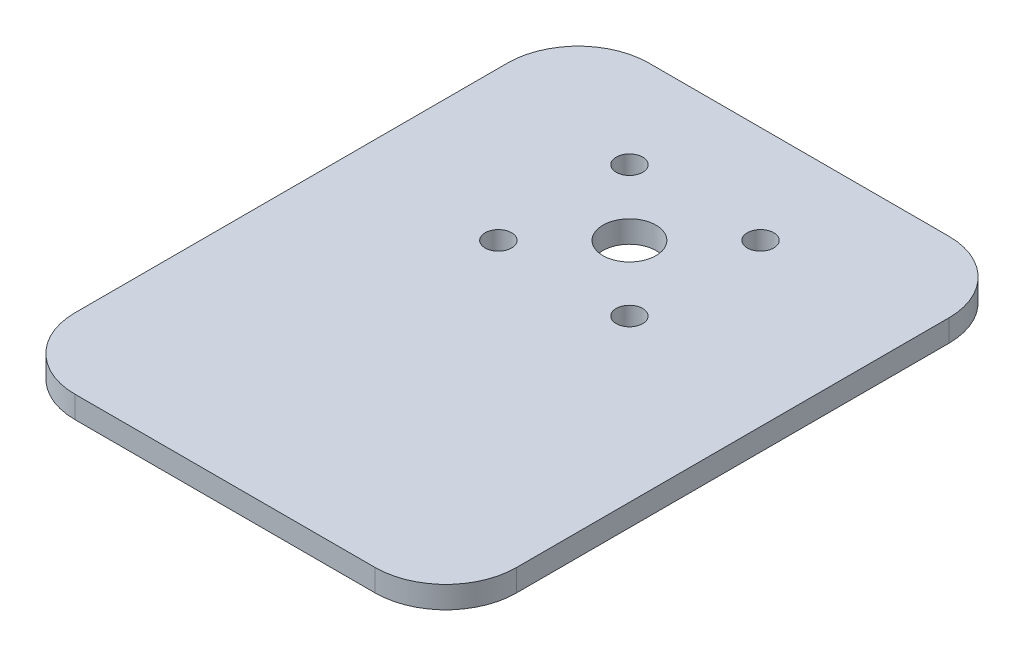
ISO-10303-21;
HEADER;
FILE_DESCRIPTION(('STEP AP214'),'2;1');
FILE_NAME('part.step','',(''),(''),'','','');
FILE_SCHEMA(('AUTOMOTIVE_DESIGN { 1 0 10303 214 1 1 1 1 }'));
ENDSEC;
DATA;
#1=APPLICATION_CONTEXT('core data for automotive mechanical design processes');
#2=APPLICATION_PROTOCOL_DEFINITION('international standard','automotive_design',2000,#1);
#3=PRODUCT_CONTEXT('',#1,'mechanical');
#4=PRODUCT('Part','Part','',(#3));
#5=PRODUCT_RELATED_PRODUCT_CATEGORY('part','',(#4));
#6=PRODUCT_DEFINITION_FORMATION('','',#4);
#7=PRODUCT_DEFINITION_CONTEXT('part definition',#1,'design');
#8=PRODUCT_DEFINITION('design','',#6,#7);
#9=PRODUCT_DEFINITION_SHAPE('','',#8);
#10=(LENGTH_UNIT() NAMED_UNIT(*) SI_UNIT(.MILLI.,.METRE.));
#11=(NAMED_UNIT(*) PLANE_ANGLE_UNIT() SI_UNIT($,.RADIAN.));
#12=(NAMED_UNIT(*) SI_UNIT($,.STERADIAN.) SOLID_ANGLE_UNIT());
#13=UNCERTAINTY_MEASURE_WITH_UNIT(LENGTH_MEASURE(1.E-05),#10,'distance_accuracy_value','');
#14=(GEOMETRIC_REPRESENTATION_CONTEXT(3) GLOBAL_UNCERTAINTY_ASSIGNED_CONTEXT((#13)) GLOBAL_UNIT_ASSIGNED_CONTEXT((#10,
#11,#12)) REPRESENTATION_CONTEXT('',''));
#15=CARTESIAN_POINT('',(0.,0.,0.));
#16=DIRECTION('',(0.,0.,1.));
#17=DIRECTION('',(1.,0.,0.));
#18=AXIS2_PLACEMENT_3D('',#15,#16,#17);
#19=CARTESIAN_POINT('',(17.,2.5,24.5));
#20=DIRECTION('',(0.,1.,0.));
#21=DIRECTION('',(0.,0.,1.));
#22=AXIS2_PLACEMENT_3D('',#19,#20,#21);
#23=PLANE('',#22);
#24=CARTESIAN_POINT('',(6.73017256995211,2.5,-6.57537879754129));
#25=DIRECTION('',(0.,1.,0.));
#26=DIRECTION('',(0.,0.,1.));
#27=AXIS2_PLACEMENT_3D('',#24,#25,#26);
#28=CIRCLE('',#27,1.5);
#29=CARTESIAN_POINT('',(6.73017256995211,2.5,-5.07537879754129));
#30=VERTEX_POINT('',#29);
#31=EDGE_CURVE('E206',#30,#30,#28,.T.);
#32=ORIENTED_EDGE('',*,*,#31,.F.);
#33=EDGE_LOOP('',(#32));
#34=FACE_BOUND('',#33,.T.);
#35=CARTESIAN_POINT('',(-8.11906983496547,2.5,-21.4246212024587));
#36=DIRECTION('',(0.,1.,0.));
#37=DIRECTION('',(0.,0.,1.));
#38=AXIS2_PLACEMENT_3D('',#35,#36,#37);
#39=CIRCLE('',#38,1.5);
#40=CARTESIAN_POINT('',(-8.11906983496547,2.5,-19.9246212024587));
#41=VERTEX_POINT('',#40);
#42=EDGE_CURVE('E194',#41,#41,#39,.T.);
#43=ORIENTED_EDGE('',*,*,#42,.F.);
#44=EDGE_LOOP('',(#43));
#45=FACE_BOUND('',#44,.T.);
#46=CARTESIAN_POINT('',(17.,2.5,24.5));
#47=DIRECTION('',(0.,1.,0.));
#48=DIRECTION('',(0.,0.,1.));
#49=AXIS2_PLACEMENT_3D('',#46,#47,#48);
#50=CIRCLE('',#49,8.);
#51=CARTESIAN_POINT('',(17.,2.5,32.5));
#52=VERTEX_POINT('',#51);
#53=CARTESIAN_POINT('',(25.,2.5,24.5));
#54=VERTEX_POINT('',#53);
#55=EDGE_CURVE('E157',#52,#54,#50,.T.);
#56=ORIENTED_EDGE('',*,*,#55,.T.);
#57=DIRECTION('',(0.,0.,-1.));
#58=VECTOR('',#57,1.);
#59=CARTESIAN_POINT('',(25.,2.5,24.5));
#60=LINE('',#59,#58);
#61=CARTESIAN_POINT('',(25.,2.5,-24.5));
#62=VERTEX_POINT('',#61);
#63=EDGE_CURVE('E105',#54,#62,#60,.T.);
#64=ORIENTED_EDGE('',*,*,#63,.T.);
#65=CARTESIAN_POINT('',(17.,2.5,-24.5));
#66=DIRECTION('',(0.,1.,0.));
#67=DIRECTION('',(0.,0.,1.));
#68=AXIS2_PLACEMENT_3D('',#65,#66,#67);
#69=CIRCLE('',#68,8.);
#70=CARTESIAN_POINT('',(17.,2.5,-32.5));
#71=VERTEX_POINT('',#70);
#72=EDGE_CURVE('E172',#62,#71,#69,.T.);
#73=ORIENTED_EDGE('',*,*,#72,.T.);
#74=DIRECTION('',(-1.,0.,0.));
#75=VECTOR('',#74,1.);
#76=CARTESIAN_POINT('',(-17.,2.5,-32.5));
#77=LINE('',#76,#75);
#78=CARTESIAN_POINT('',(-17.,2.5,-32.5));
#79=VERTEX_POINT('',#78);
#80=EDGE_CURVE('E185',#71,#79,#77,.T.);
#81=ORIENTED_EDGE('',*,*,#80,.T.);
#82=CARTESIAN_POINT('',(-17.,2.5,-24.5));
#83=DIRECTION('',(0.,1.,0.));
#84=DIRECTION('',(0.,0.,-1.));
#85=AXIS2_PLACEMENT_3D('',#82,#83,#84);
#86=CIRCLE('',#85,8.);
#87=CARTESIAN_POINT('',(-25.,2.5,-24.5));
#88=VERTEX_POINT('',#87);
#89=EDGE_CURVE('E124',#79,#88,#86,.T.);
#90=ORIENTED_EDGE('',*,*,#89,.T.);
#91=DIRECTION('',(0.,0.,1.));
#92=VECTOR('',#91,1.);
#93=CARTESIAN_POINT('',(-25.,2.5,24.5));
#94=LINE('',#93,#92);
#95=CARTESIAN_POINT('',(-25.,2.5,24.5));
#96=VERTEX_POINT('',#95);
#97=EDGE_CURVE('E118',#88,#96,#94,.T.);
#98=ORIENTED_EDGE('',*,*,#97,.T.);
#99=CARTESIAN_POINT('',(-17.,2.5,24.5));
#100=DIRECTION('',(0.,1.,0.));
#101=DIRECTION('',(0.,0.,-1.));
#102=AXIS2_PLACEMENT_3D('',#99,#100,#101);
#103=CIRCLE('',#102,8.);
#104=CARTESIAN_POINT('',(-17.,2.5,32.5));
#105=VERTEX_POINT('',#104);
#106=EDGE_CURVE('E122',#96,#105,#103,.T.);
#107=ORIENTED_EDGE('',*,*,#106,.T.);
#108=DIRECTION('',(1.,0.,0.));
#109=VECTOR('',#108,1.);
#110=CARTESIAN_POINT('',(-17.,2.5,32.5));
#111=LINE('',#110,#109);
#112=EDGE_CURVE('E62',#105,#52,#111,.T.);
#113=ORIENTED_EDGE('',*,*,#112,.T.);
#114=EDGE_LOOP('',(#56,#64,#73,#81,#90,#98,#107,#113));
#115=FACE_BOUND('',#114,.T.);
#116=CARTESIAN_POINT('',(6.73017256995211,2.5,-21.4246212024587));
#117=DIRECTION('',(0.,1.,0.));
#118=DIRECTION('',(0.,0.,1.));
#119=AXIS2_PLACEMENT_3D('',#116,#117,#118);
#120=CIRCLE('',#119,1.5);
#121=CARTESIAN_POINT('',(6.73017256995211,2.5,-19.9246212024587));
#122=VERTEX_POINT('',#121);
#123=EDGE_CURVE('E146',#122,#122,#120,.T.);
#124=ORIENTED_EDGE('',*,*,#123,.F.);
#125=EDGE_LOOP('',(#124));
#126=FACE_BOUND('',#125,.T.);
#127=CARTESIAN_POINT('',(-8.11906983496547,2.5,-6.57537879754129));
#128=DIRECTION('',(0.,1.,0.));
#129=DIRECTION('',(0.,0.,1.));
#130=AXIS2_PLACEMENT_3D('',#127,#128,#129);
#131=CIRCLE('',#130,1.5);
#132=CARTESIAN_POINT('',(-8.11906983496547,2.5,-5.07537879754129));
#133=VERTEX_POINT('',#132);
#134=EDGE_CURVE('E200',#133,#133,#131,.T.);
#135=ORIENTED_EDGE('',*,*,#134,.F.);
#136=EDGE_LOOP('',(#135));
#137=FACE_BOUND('',#136,.T.);
#138=CARTESIAN_POINT('',(-0.694448632506681,2.5,-14.));
#139=DIRECTION('',(0.,1.,0.));
#140=DIRECTION('',(0.,0.,1.));
#141=AXIS2_PLACEMENT_3D('',#138,#139,#140);
#142=CIRCLE('',#141,3.);
#143=CARTESIAN_POINT('',(-0.694448632506681,2.5,-11.));
#144=VERTEX_POINT('',#143);
#145=EDGE_CURVE('E212',#144,#144,#142,.T.);
#146=ORIENTED_EDGE('',*,*,#145,.F.);
#147=EDGE_LOOP('',(#146));
#148=FACE_BOUND('',#147,.T.);
#149=ADVANCED_FACE('F45',(#34,#45,#115,#126,#137,#148),#23,.T.);
#150=CARTESIAN_POINT('',(17.,0.,24.5));
#151=DIRECTION('',(0.,1.,0.));
#152=DIRECTION('',(0.,0.,1.));
#153=AXIS2_PLACEMENT_3D('',#150,#151,#152);
#154=PLANE('',#153);
#155=CARTESIAN_POINT('',(17.,0.,24.5));
#156=DIRECTION('',(0.,1.,0.));
#157=DIRECTION('',(0.,0.,1.));
#158=AXIS2_PLACEMENT_3D('',#155,#156,#157);
#159=CIRCLE('',#158,8.);
#160=CARTESIAN_POINT('',(17.,0.,32.5));
#161=VERTEX_POINT('',#160);
#162=CARTESIAN_POINT('',(25.,0.,24.5));
#163=VERTEX_POINT('',#162);
#164=EDGE_CURVE('E142',#161,#163,#159,.T.);
#165=ORIENTED_EDGE('',*,*,#164,.F.);
#166=DIRECTION('',(1.,0.,0.));
#167=VECTOR('',#166,1.);
#168=CARTESIAN_POINT('',(-17.,0.,32.5));
#169=LINE('',#168,#167);
#170=CARTESIAN_POINT('',(-17.,0.,32.5));
#171=VERTEX_POINT('',#170);
#172=EDGE_CURVE('E97',#171,#161,#169,.T.);
#173=ORIENTED_EDGE('',*,*,#172,.F.);
#174=CARTESIAN_POINT('',(-17.,0.,24.5));
#175=DIRECTION('',(0.,1.,0.));
#176=DIRECTION('',(0.,0.,-1.));
#177=AXIS2_PLACEMENT_3D('',#174,#175,#176);
#178=CIRCLE('',#177,8.);
#179=CARTESIAN_POINT('',(-25.,0.,24.5));
#180=VERTEX_POINT('',#179);
#181=EDGE_CURVE('E91',#180,#171,#178,.T.);
#182=ORIENTED_EDGE('',*,*,#181,.F.);
#183=DIRECTION('',(0.,0.,1.));
#184=VECTOR('',#183,1.);
#185=CARTESIAN_POINT('',(-25.,0.,24.5));
#186=LINE('',#185,#184);
#187=CARTESIAN_POINT('',(-25.,0.,-24.5));
#188=VERTEX_POINT('',#187);
#189=EDGE_CURVE('E132',#188,#180,#186,.T.);
#190=ORIENTED_EDGE('',*,*,#189,.F.);
#191=CARTESIAN_POINT('',(-17.,0.,-24.5));
#192=DIRECTION('',(0.,1.,0.));
#193=DIRECTION('',(0.,0.,-1.));
#194=AXIS2_PLACEMENT_3D('',#191,#192,#193);
#195=CIRCLE('',#194,8.);
#196=CARTESIAN_POINT('',(-17.,0.,-32.5));
#197=VERTEX_POINT('',#196);
#198=EDGE_CURVE('E152',#197,#188,#195,.T.);
#199=ORIENTED_EDGE('',*,*,#198,.F.);
#200=DIRECTION('',(-1.,0.,0.));
#201=VECTOR('',#200,1.);
#202=CARTESIAN_POINT('',(-17.,0.,-32.5));
#203=LINE('',#202,#201);
#204=CARTESIAN_POINT('',(17.,0.,-32.5));
#205=VERTEX_POINT('',#204);
#206=EDGE_CURVE('E150',#205,#197,#203,.T.);
#207=ORIENTED_EDGE('',*,*,#206,.F.);
#208=CARTESIAN_POINT('',(17.,0.,-24.5));
#209=DIRECTION('',(0.,1.,0.));
#210=DIRECTION('',(0.,0.,1.));
#211=AXIS2_PLACEMENT_3D('',#208,#209,#210);
#212=CIRCLE('',#211,8.);
#213=CARTESIAN_POINT('',(25.,0.,-24.5));
#214=VERTEX_POINT('',#213);
#215=EDGE_CURVE('E148',#214,#205,#212,.T.);
#216=ORIENTED_EDGE('',*,*,#215,.F.);
#217=DIRECTION('',(0.,0.,-1.));
#218=VECTOR('',#217,1.);
#219=CARTESIAN_POINT('',(25.,0.,24.5));
#220=LINE('',#219,#218);
#221=EDGE_CURVE('E145',#163,#214,#220,.T.);
#222=ORIENTED_EDGE('',*,*,#221,.F.);
#223=EDGE_LOOP('',(#165,#173,#182,#190,#199,#207,#216,#222));
#224=FACE_BOUND('',#223,.T.);
#225=CARTESIAN_POINT('',(6.73017256995211,0.,-21.4246212024587));
#226=DIRECTION('',(0.,1.,0.));
#227=DIRECTION('',(0.,0.,1.));
#228=AXIS2_PLACEMENT_3D('',#225,#226,#227);
#229=CIRCLE('',#228,1.5);
#230=CARTESIAN_POINT('',(6.73017256995211,0.,-19.9246212024587));
#231=VERTEX_POINT('',#230);
#232=EDGE_CURVE('E191',#231,#231,#229,.T.);
#233=ORIENTED_EDGE('',*,*,#232,.T.);
#234=EDGE_LOOP('',(#233));
#235=FACE_BOUND('',#234,.T.);
#236=CARTESIAN_POINT('',(-8.11906983496547,0.,-21.4246212024587));
#237=DIRECTION('',(0.,1.,0.));
#238=DIRECTION('',(0.,0.,1.));
#239=AXIS2_PLACEMENT_3D('',#236,#237,#238);
#240=CIRCLE('',#239,1.5);
#241=CARTESIAN_POINT('',(-8.11906983496547,0.,-19.9246212024587));
#242=VERTEX_POINT('',#241);
#243=EDGE_CURVE('E197',#242,#242,#240,.T.);
#244=ORIENTED_EDGE('',*,*,#243,.T.);
#245=EDGE_LOOP('',(#244));
#246=FACE_BOUND('',#245,.T.);
#247=CARTESIAN_POINT('',(-8.11906983496547,0.,-6.57537879754129));
#248=DIRECTION('',(0.,1.,0.));
#249=DIRECTION('',(0.,0.,1.));
#250=AXIS2_PLACEMENT_3D('',#247,#248,#249);
#251=CIRCLE('',#250,1.5);
#252=CARTESIAN_POINT('',(-8.11906983496547,0.,-5.07537879754129));
#253=VERTEX_POINT('',#252);
#254=EDGE_CURVE('E203',#253,#253,#251,.T.);
#255=ORIENTED_EDGE('',*,*,#254,.T.);
#256=EDGE_LOOP('',(#255));
#257=FACE_BOUND('',#256,.T.);
#258=CARTESIAN_POINT('',(6.73017256995211,0.,-6.57537879754129));
#259=DIRECTION('',(0.,1.,0.));
#260=DIRECTION('',(0.,0.,1.));
#261=AXIS2_PLACEMENT_3D('',#258,#259,#260);
#262=CIRCLE('',#261,1.5);
#263=CARTESIAN_POINT('',(6.73017256995211,0.,-5.07537879754129));
#264=VERTEX_POINT('',#263);
#265=EDGE_CURVE('E209',#264,#264,#262,.T.);
#266=ORIENTED_EDGE('',*,*,#265,.T.);
#267=EDGE_LOOP('',(#266));
#268=FACE_BOUND('',#267,.T.);
#269=CARTESIAN_POINT('',(-0.694448632506681,0.,-14.));
#270=DIRECTION('',(0.,1.,0.));
#271=DIRECTION('',(0.,0.,1.));
#272=AXIS2_PLACEMENT_3D('',#269,#270,#271);
#273=CIRCLE('',#272,3.);
#274=CARTESIAN_POINT('',(-0.694448632506681,0.,-11.));
#275=VERTEX_POINT('',#274);
#276=EDGE_CURVE('E215',#275,#275,#273,.T.);
#277=ORIENTED_EDGE('',*,*,#276,.T.);
#278=EDGE_LOOP('',(#277));
#279=FACE_BOUND('',#278,.T.);
#280=ADVANCED_FACE('F176',(#224,#235,#246,#257,#268,#279),#154,.F.);
#281=CARTESIAN_POINT('',(17.,2.5,24.5));
#282=DIRECTION('',(0.,-1.,0.));
#283=DIRECTION('',(0.,0.,-1.));
#284=AXIS2_PLACEMENT_3D('',#281,#282,#283);
#285=CYLINDRICAL_SURFACE('',#284,8.);
#286=ORIENTED_EDGE('',*,*,#164,.T.);
#287=DIRECTION('',(0.,-1.,0.));
#288=VECTOR('',#287,1.);
#289=CARTESIAN_POINT('',(25.,2.5,24.5));
#290=LINE('',#289,#288);
#291=EDGE_CURVE('E11',#54,#163,#290,.T.);
#292=ORIENTED_EDGE('',*,*,#291,.F.);
#293=ORIENTED_EDGE('',*,*,#55,.F.);
#294=DIRECTION('',(0.,-1.,0.));
#295=VECTOR('',#294,1.);
#296=CARTESIAN_POINT('',(17.,2.5,32.5));
#297=LINE('',#296,#295);
#298=EDGE_CURVE('E138',#52,#161,#297,.T.);
#299=ORIENTED_EDGE('',*,*,#298,.T.);
#300=EDGE_LOOP('',(#286,#292,#293,#299));
#301=FACE_BOUND('',#300,.T.);
#302=ADVANCED_FACE('F47',(#301),#285,.T.);
#303=CARTESIAN_POINT('',(25.,2.5,24.5));
#304=DIRECTION('',(-1.,0.,0.));
#305=DIRECTION('',(0.,0.,1.));
#306=AXIS2_PLACEMENT_3D('',#303,#304,#305);
#307=PLANE('',#306);
#308=ORIENTED_EDGE('',*,*,#221,.T.);
#309=DIRECTION('',(0.,-1.,0.));
#310=VECTOR('',#309,1.);
#311=CARTESIAN_POINT('',(25.,2.5,-24.5));
#312=LINE('',#311,#310);
#313=EDGE_CURVE('E54',#62,#214,#312,.T.);
#314=ORIENTED_EDGE('',*,*,#313,.F.);
#315=ORIENTED_EDGE('',*,*,#63,.F.);
#316=ORIENTED_EDGE('',*,*,#291,.T.);
#317=EDGE_LOOP('',(#308,#314,#315,#316));
#318=FACE_BOUND('',#317,.T.);
#319=ADVANCED_FACE('F249',(#318),#307,.F.);
#320=CARTESIAN_POINT('',(17.,2.5,-24.5));
#321=DIRECTION('',(0.,-1.,0.));
#322=DIRECTION('',(0.,0.,-1.));
#323=AXIS2_PLACEMENT_3D('',#320,#321,#322);
#324=CYLINDRICAL_SURFACE('',#323,8.);
#325=ORIENTED_EDGE('',*,*,#215,.T.);
#326=DIRECTION('',(0.,-1.,0.));
#327=VECTOR('',#326,1.);
#328=CARTESIAN_POINT('',(17.,2.5,-32.5));
#329=LINE('',#328,#327);
#330=EDGE_CURVE('E164',#71,#205,#329,.T.);
#331=ORIENTED_EDGE('',*,*,#330,.F.);
#332=ORIENTED_EDGE('',*,*,#72,.F.);
#333=ORIENTED_EDGE('',*,*,#313,.T.);
#334=EDGE_LOOP('',(#325,#331,#332,#333));
#335=FACE_BOUND('',#334,.T.);
#336=ADVANCED_FACE('F170',(#335),#324,.T.);
#337=CARTESIAN_POINT('',(-17.,2.5,-32.5));
#338=DIRECTION('',(0.,0.,1.));
#339=DIRECTION('',(1.,0.,0.));
#340=AXIS2_PLACEMENT_3D('',#337,#338,#339);
#341=PLANE('',#340);
#342=ORIENTED_EDGE('',*,*,#206,.T.);
#343=DIRECTION('',(0.,-1.,0.));
#344=VECTOR('',#343,1.);
#345=CARTESIAN_POINT('',(-17.,2.5,-32.5));
#346=LINE('',#345,#344);
#347=EDGE_CURVE('E161',#79,#197,#346,.T.);
#348=ORIENTED_EDGE('',*,*,#347,.F.);
#349=ORIENTED_EDGE('',*,*,#80,.F.);
#350=ORIENTED_EDGE('',*,*,#330,.T.);
#351=EDGE_LOOP('',(#342,#348,#349,#350));
#352=FACE_BOUND('',#351,.T.);
#353=ADVANCED_FACE('F181',(#352),#341,.F.);
#354=CARTESIAN_POINT('',(-17.,2.5,-24.5));
#355=DIRECTION('',(0.,-1.,0.));
#356=DIRECTION('',(0.,0.,-1.));
#357=AXIS2_PLACEMENT_3D('',#354,#355,#356);
#358=CYLINDRICAL_SURFACE('',#357,8.);
#359=ORIENTED_EDGE('',*,*,#198,.T.);
#360=DIRECTION('',(0.,-1.,0.));
#361=VECTOR('',#360,1.);
#362=CARTESIAN_POINT('',(-25.,2.5,-24.5));
#363=LINE('',#362,#361);
#364=EDGE_CURVE('E133',#88,#188,#363,.T.);
#365=ORIENTED_EDGE('',*,*,#364,.F.);
#366=ORIENTED_EDGE('',*,*,#89,.F.);
#367=ORIENTED_EDGE('',*,*,#347,.T.);
#368=EDGE_LOOP('',(#359,#365,#366,#367));
#369=FACE_BOUND('',#368,.T.);
#370=ADVANCED_FACE('F184',(#369),#358,.T.);
#371=CARTESIAN_POINT('',(-25.,2.5,24.5));
#372=DIRECTION('',(1.,0.,0.));
#373=DIRECTION('',(0.,0.,-1.));
#374=AXIS2_PLACEMENT_3D('',#371,#372,#373);
#375=PLANE('',#374);
#376=ORIENTED_EDGE('',*,*,#189,.T.);
#377=DIRECTION('',(0.,-1.,0.));
#378=VECTOR('',#377,1.);
#379=CARTESIAN_POINT('',(-25.,2.5,24.5));
#380=LINE('',#379,#378);
#381=EDGE_CURVE('E129',#96,#180,#380,.T.);
#382=ORIENTED_EDGE('',*,*,#381,.F.);
#383=ORIENTED_EDGE('',*,*,#97,.F.);
#384=ORIENTED_EDGE('',*,*,#364,.T.);
#385=EDGE_LOOP('',(#376,#382,#383,#384));
#386=FACE_BOUND('',#385,.T.);
#387=ADVANCED_FACE('F130',(#386),#375,.F.);
#388=CARTESIAN_POINT('',(-17.,2.5,24.5));
#389=DIRECTION('',(0.,-1.,0.));
#390=DIRECTION('',(0.,0.,-1.));
#391=AXIS2_PLACEMENT_3D('',#388,#389,#390);
#392=CYLINDRICAL_SURFACE('',#391,8.);
#393=ORIENTED_EDGE('',*,*,#181,.T.);
#394=DIRECTION('',(0.,-1.,0.));
#395=VECTOR('',#394,1.);
#396=CARTESIAN_POINT('',(-17.,2.5,32.5));
#397=LINE('',#396,#395);
#398=EDGE_CURVE('E134',#105,#171,#397,.T.);
#399=ORIENTED_EDGE('',*,*,#398,.F.);
#400=ORIENTED_EDGE('',*,*,#106,.F.);
#401=ORIENTED_EDGE('',*,*,#381,.T.);
#402=EDGE_LOOP('',(#393,#399,#400,#401));
#403=FACE_BOUND('',#402,.T.);
#404=ADVANCED_FACE('F136',(#403),#392,.T.);
#405=CARTESIAN_POINT('',(-17.,2.5,32.5));
#406=DIRECTION('',(0.,0.,-1.));
#407=DIRECTION('',(-1.,0.,0.));
#408=AXIS2_PLACEMENT_3D('',#405,#406,#407);
#409=PLANE('',#408);
#410=ORIENTED_EDGE('',*,*,#172,.T.);
#411=ORIENTED_EDGE('',*,*,#298,.F.);
#412=ORIENTED_EDGE('',*,*,#112,.F.);
#413=ORIENTED_EDGE('',*,*,#398,.T.);
#414=EDGE_LOOP('',(#410,#411,#412,#413));
#415=FACE_BOUND('',#414,.T.);
#416=ADVANCED_FACE('F237',(#415),#409,.F.);
#417=CARTESIAN_POINT('',(6.73017256995211,2.5,-21.4246212024587));
#418=DIRECTION('',(0.,-1.,0.));
#419=DIRECTION('',(0.,0.,-1.));
#420=AXIS2_PLACEMENT_3D('',#417,#418,#419);
#421=CYLINDRICAL_SURFACE('',#420,1.5);
#422=ORIENTED_EDGE('',*,*,#123,.T.);
#423=EDGE_LOOP('',(#422));
#424=FACE_BOUND('',#423,.T.);
#425=ORIENTED_EDGE('',*,*,#232,.F.);
#426=EDGE_LOOP('',(#425));
#427=FACE_BOUND('',#426,.T.);
#428=ADVANCED_FACE('F234',(#424,#427),#421,.F.);
#429=CARTESIAN_POINT('',(-8.11906983496547,2.5,-21.4246212024587));
#430=DIRECTION('',(0.,-1.,0.));
#431=DIRECTION('',(0.,0.,-1.));
#432=AXIS2_PLACEMENT_3D('',#429,#430,#431);
#433=CYLINDRICAL_SURFACE('',#432,1.5);
#434=ORIENTED_EDGE('',*,*,#42,.T.);
#435=EDGE_LOOP('',(#434));
#436=FACE_BOUND('',#435,.T.);
#437=ORIENTED_EDGE('',*,*,#243,.F.);
#438=EDGE_LOOP('',(#437));
#439=FACE_BOUND('',#438,.T.);
#440=ADVANCED_FACE('F325',(#436,#439),#433,.F.);
#441=CARTESIAN_POINT('',(-8.11906983496547,2.5,-6.57537879754129));
#442=DIRECTION('',(0.,-1.,0.));
#443=DIRECTION('',(0.,0.,-1.));
#444=AXIS2_PLACEMENT_3D('',#441,#442,#443);
#445=CYLINDRICAL_SURFACE('',#444,1.5);
#446=ORIENTED_EDGE('',*,*,#134,.T.);
#447=EDGE_LOOP('',(#446));
#448=FACE_BOUND('',#447,.T.);
#449=ORIENTED_EDGE('',*,*,#254,.F.);
#450=EDGE_LOOP('',(#449));
#451=FACE_BOUND('',#450,.T.);
#452=ADVANCED_FACE('F334',(#448,#451),#445,.F.);
#453=CARTESIAN_POINT('',(6.73017256995211,2.5,-6.57537879754129));
#454=DIRECTION('',(0.,-1.,0.));
#455=DIRECTION('',(0.,0.,-1.));
#456=AXIS2_PLACEMENT_3D('',#453,#454,#455);
#457=CYLINDRICAL_SURFACE('',#456,1.5);
#458=ORIENTED_EDGE('',*,*,#31,.T.);
#459=EDGE_LOOP('',(#458));
#460=FACE_BOUND('',#459,.T.);
#461=ORIENTED_EDGE('',*,*,#265,.F.);
#462=EDGE_LOOP('',(#461));
#463=FACE_BOUND('',#462,.T.);
#464=ADVANCED_FACE('F343',(#460,#463),#457,.F.);
#465=CARTESIAN_POINT('',(-0.694448632506681,2.5,-14.));
#466=DIRECTION('',(0.,-1.,0.));
#467=DIRECTION('',(0.,0.,-1.));
#468=AXIS2_PLACEMENT_3D('',#465,#466,#467);
#469=CYLINDRICAL_SURFACE('',#468,3.);
#470=ORIENTED_EDGE('',*,*,#145,.T.);
#471=EDGE_LOOP('',(#470));
#472=FACE_BOUND('',#471,.T.);
#473=ORIENTED_EDGE('',*,*,#276,.F.);
#474=EDGE_LOOP('',(#473));
#475=FACE_BOUND('',#474,.T.);
#476=ADVANCED_FACE('F221',(#472,#475),#469,.F.);
#477=CLOSED_SHELL('',(#149,#280,#302,#319,#336,#353,#370,#387,#404,#416,#428,#440,#452,#464,#476));
#478=MANIFOLD_SOLID_BREP('B2',#477);
#479=ADVANCED_BREP_SHAPE_REPRESENTATION('',(#18,#478),#14);
#480=SHAPE_DEFINITION_REPRESENTATION(#9,#479);
ENDSEC;
END-ISO-10303-21;
